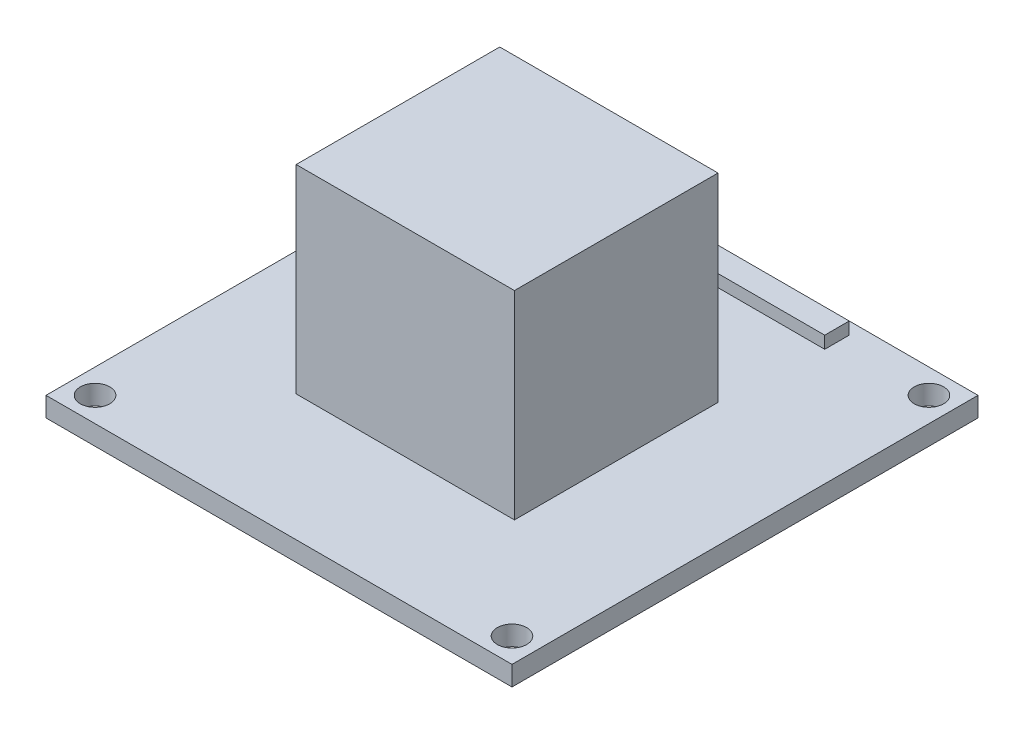
ISO-10303-21;
HEADER;
FILE_DESCRIPTION(('STEP AP214'),'2;1');
FILE_NAME('part.step','',(''),(''),'','','');
FILE_SCHEMA(('AUTOMOTIVE_DESIGN { 1 0 10303 214 1 1 1 1 }'));
ENDSEC;
DATA;
#1=APPLICATION_CONTEXT('core data for automotive mechanical design processes');
#2=APPLICATION_PROTOCOL_DEFINITION('international standard','automotive_design',2000,#1);
#3=PRODUCT_CONTEXT('',#1,'mechanical');
#4=PRODUCT('Part','Part','',(#3));
#5=PRODUCT_RELATED_PRODUCT_CATEGORY('part','',(#4));
#6=PRODUCT_DEFINITION_FORMATION('','',#4);
#7=PRODUCT_DEFINITION_CONTEXT('part definition',#1,'design');
#8=PRODUCT_DEFINITION('design','',#6,#7);
#9=PRODUCT_DEFINITION_SHAPE('','',#8);
#10=(LENGTH_UNIT() NAMED_UNIT(*) SI_UNIT(.MILLI.,.METRE.));
#11=(NAMED_UNIT(*) PLANE_ANGLE_UNIT() SI_UNIT($,.RADIAN.));
#12=(NAMED_UNIT(*) SI_UNIT($,.STERADIAN.) SOLID_ANGLE_UNIT());
#13=UNCERTAINTY_MEASURE_WITH_UNIT(LENGTH_MEASURE(1.E-05),#10,'distance_accuracy_value','');
#14=(GEOMETRIC_REPRESENTATION_CONTEXT(3) GLOBAL_UNCERTAINTY_ASSIGNED_CONTEXT((#13)) GLOBAL_UNIT_ASSIGNED_CONTEXT((#10,
#11,#12)) REPRESENTATION_CONTEXT('',''));
#15=CARTESIAN_POINT('',(0.,0.,0.));
#16=DIRECTION('',(0.,0.,1.));
#17=DIRECTION('',(1.,0.,0.));
#18=AXIS2_PLACEMENT_3D('',#15,#16,#17);
#19=CARTESIAN_POINT('',(0.,1.6,0.));
#20=DIRECTION('',(0.,1.,0.));
#21=DIRECTION('',(0.,0.,1.));
#22=AXIS2_PLACEMENT_3D('',#19,#20,#21);
#23=PLANE('',#22);
#24=DIRECTION('',(0.,0.,1.));
#25=VECTOR('',#24,1.);
#26=CARTESIAN_POINT('',(-8.9,1.6,-7.9));
#27=LINE('',#26,#25);
#28=CARTESIAN_POINT('',(-8.9,1.6,-7.9));
#29=VERTEX_POINT('',#28);
#30=CARTESIAN_POINT('',(-8.9,1.6,8.7));
#31=VERTEX_POINT('',#30);
#32=EDGE_CURVE('E66',#29,#31,#27,.T.);
#33=ORIENTED_EDGE('',*,*,#32,.F.);
#34=DIRECTION('',(-1.,0.,0.));
#35=VECTOR('',#34,1.);
#36=CARTESIAN_POINT('',(-8.9,1.6,-7.9));
#37=LINE('',#36,#35);
#38=CARTESIAN_POINT('',(8.9,1.6,-7.9));
#39=VERTEX_POINT('',#38);
#40=EDGE_CURVE('E167',#39,#29,#37,.T.);
#41=ORIENTED_EDGE('',*,*,#40,.F.);
#42=DIRECTION('',(0.,0.,-1.));
#43=VECTOR('',#42,1.);
#44=CARTESIAN_POINT('',(8.9,1.6,-7.9));
#45=LINE('',#44,#43);
#46=CARTESIAN_POINT('',(8.9,1.6,8.7));
#47=VERTEX_POINT('',#46);
#48=EDGE_CURVE('E176',#47,#39,#45,.T.);
#49=ORIENTED_EDGE('',*,*,#48,.F.);
#50=DIRECTION('',(1.,0.,0.));
#51=VECTOR('',#50,1.);
#52=CARTESIAN_POINT('',(-8.9,1.6,8.7));
#53=LINE('',#52,#51);
#54=EDGE_CURVE('E158',#31,#47,#53,.T.);
#55=ORIENTED_EDGE('',*,*,#54,.F.);
#56=EDGE_LOOP('',(#33,#41,#49,#55));
#57=FACE_BOUND('',#56,.T.);
#58=CARTESIAN_POINT('',(17.0000000000004,1.6,17.));
#59=DIRECTION('',(0.,1.,0.));
#60=DIRECTION('',(0.,0.,1.));
#61=AXIS2_PLACEMENT_3D('',#58,#59,#60);
#62=CIRCLE('',#61,1.2);
#63=CARTESIAN_POINT('',(17.0000000000004,1.6,18.2));
#64=VERTEX_POINT('',#63);
#65=EDGE_CURVE('E198',#64,#64,#62,.T.);
#66=ORIENTED_EDGE('',*,*,#65,.F.);
#67=EDGE_LOOP('',(#66));
#68=FACE_BOUND('',#67,.T.);
#69=CARTESIAN_POINT('',(-17.,1.6,-17.));
#70=DIRECTION('',(0.,1.,0.));
#71=DIRECTION('',(0.,0.,1.));
#72=AXIS2_PLACEMENT_3D('',#69,#70,#71);
#73=CIRCLE('',#72,1.2);
#74=CARTESIAN_POINT('',(-17.,1.6,-15.8));
#75=VERTEX_POINT('',#74);
#76=EDGE_CURVE('E210',#75,#75,#73,.T.);
#77=ORIENTED_EDGE('',*,*,#76,.F.);
#78=EDGE_LOOP('',(#77));
#79=FACE_BOUND('',#78,.T.);
#80=DIRECTION('',(0.,0.,1.));
#81=VECTOR('',#80,1.);
#82=CARTESIAN_POINT('',(-19.,1.6,-19.));
#83=LINE('',#82,#81);
#84=CARTESIAN_POINT('',(-19.,1.6,-19.));
#85=VERTEX_POINT('',#84);
#86=CARTESIAN_POINT('',(-19.,1.6,19.));
#87=VERTEX_POINT('',#86);
#88=EDGE_CURVE('E216',#85,#87,#83,.T.);
#89=ORIENTED_EDGE('',*,*,#88,.T.);
#90=DIRECTION('',(1.,0.,0.));
#91=VECTOR('',#90,1.);
#92=CARTESIAN_POINT('',(-19.,1.6,19.));
#93=LINE('',#92,#91);
#94=CARTESIAN_POINT('',(19.,1.6,19.));
#95=VERTEX_POINT('',#94);
#96=EDGE_CURVE('E219',#87,#95,#93,.T.);
#97=ORIENTED_EDGE('',*,*,#96,.T.);
#98=DIRECTION('',(0.,0.,-1.));
#99=VECTOR('',#98,1.);
#100=CARTESIAN_POINT('',(19.,1.6,-19.));
#101=LINE('',#100,#99);
#102=CARTESIAN_POINT('',(19.,1.6,-19.));
#103=VERTEX_POINT('',#102);
#104=EDGE_CURVE('E222',#95,#103,#101,.T.);
#105=ORIENTED_EDGE('',*,*,#104,.T.);
#106=DIRECTION('',(-1.,0.,0.));
#107=VECTOR('',#106,1.);
#108=CARTESIAN_POINT('',(-19.,1.6,-19.));
#109=LINE('',#108,#107);
#110=EDGE_CURVE('E224',#103,#85,#109,.T.);
#111=ORIENTED_EDGE('',*,*,#110,.T.);
#112=EDGE_LOOP('',(#89,#97,#105,#111));
#113=FACE_BOUND('',#112,.T.);
#114=CARTESIAN_POINT('',(17.,1.6,-17.));
#115=DIRECTION('',(0.,1.,0.));
#116=DIRECTION('',(0.,0.,1.));
#117=AXIS2_PLACEMENT_3D('',#114,#115,#116);
#118=CIRCLE('',#117,1.2);
#119=CARTESIAN_POINT('',(17.,1.6,-15.8));
#120=VERTEX_POINT('',#119);
#121=EDGE_CURVE('E204',#120,#120,#118,.T.);
#122=ORIENTED_EDGE('',*,*,#121,.F.);
#123=EDGE_LOOP('',(#122));
#124=FACE_BOUND('',#123,.T.);
#125=CARTESIAN_POINT('',(-16.9999999999996,1.6,17.));
#126=DIRECTION('',(0.,1.,0.));
#127=DIRECTION('',(0.,0.,1.));
#128=AXIS2_PLACEMENT_3D('',#125,#126,#127);
#129=CIRCLE('',#128,1.2);
#130=CARTESIAN_POINT('',(-16.9999999999996,1.6,18.2));
#131=VERTEX_POINT('',#130);
#132=EDGE_CURVE('E192',#131,#131,#129,.T.);
#133=ORIENTED_EDGE('',*,*,#132,.F.);
#134=EDGE_LOOP('',(#133));
#135=FACE_BOUND('',#134,.T.);
#136=DIRECTION('',(1.,0.,0.));
#137=VECTOR('',#136,1.);
#138=CARTESIAN_POINT('',(-9.5,1.6,-16.));
#139=LINE('',#138,#137);
#140=CARTESIAN_POINT('',(-9.5,1.6,-16.));
#141=VERTEX_POINT('',#140);
#142=CARTESIAN_POINT('',(9.5,1.6,-16.));
#143=VERTEX_POINT('',#142);
#144=EDGE_CURVE('E518',#141,#143,#139,.T.);
#145=ORIENTED_EDGE('',*,*,#144,.F.);
#146=DIRECTION('',(0.,0.,1.));
#147=VECTOR('',#146,1.);
#148=CARTESIAN_POINT('',(-9.5,1.6,-18.));
#149=LINE('',#148,#147);
#150=CARTESIAN_POINT('',(-9.5,1.6,-18.));
#151=VERTEX_POINT('',#150);
#152=EDGE_CURVE('E155',#151,#141,#149,.T.);
#153=ORIENTED_EDGE('',*,*,#152,.F.);
#154=DIRECTION('',(-1.,0.,0.));
#155=VECTOR('',#154,1.);
#156=CARTESIAN_POINT('',(-9.5,1.6,-18.));
#157=LINE('',#156,#155);
#158=CARTESIAN_POINT('',(9.5,1.6,-18.));
#159=VERTEX_POINT('',#158);
#160=EDGE_CURVE('E151',#159,#151,#157,.T.);
#161=ORIENTED_EDGE('',*,*,#160,.F.);
#162=DIRECTION('',(0.,0.,-1.));
#163=VECTOR('',#162,1.);
#164=CARTESIAN_POINT('',(9.5,1.6,-18.));
#165=LINE('',#164,#163);
#166=EDGE_CURVE('E515',#143,#159,#165,.T.);
#167=ORIENTED_EDGE('',*,*,#166,.F.);
#168=EDGE_LOOP('',(#145,#153,#161,#167));
#169=FACE_BOUND('',#168,.T.);
#170=ADVANCED_FACE('F43',(#57,#68,#79,#113,#124,#135,#169),#23,.T.);
#171=CARTESIAN_POINT('',(0.,0.,0.));
#172=DIRECTION('',(0.,1.,0.));
#173=DIRECTION('',(0.,0.,1.));
#174=AXIS2_PLACEMENT_3D('',#171,#172,#173);
#175=PLANE('',#174);
#176=DIRECTION('',(0.,0.,1.));
#177=VECTOR('',#176,1.);
#178=CARTESIAN_POINT('',(-19.,0.,-19.));
#179=LINE('',#178,#177);
#180=CARTESIAN_POINT('',(-19.,0.,-19.));
#181=VERTEX_POINT('',#180);
#182=CARTESIAN_POINT('',(-19.,0.,19.));
#183=VERTEX_POINT('',#182);
#184=EDGE_CURVE('E213',#181,#183,#179,.T.);
#185=ORIENTED_EDGE('',*,*,#184,.F.);
#186=DIRECTION('',(-1.,0.,0.));
#187=VECTOR('',#186,1.);
#188=CARTESIAN_POINT('',(-19.,0.,-19.));
#189=LINE('',#188,#187);
#190=CARTESIAN_POINT('',(19.,0.,-19.));
#191=VERTEX_POINT('',#190);
#192=EDGE_CURVE('E220',#191,#181,#189,.T.);
#193=ORIENTED_EDGE('',*,*,#192,.F.);
#194=DIRECTION('',(0.,0.,-1.));
#195=VECTOR('',#194,1.);
#196=CARTESIAN_POINT('',(19.,0.,-19.));
#197=LINE('',#196,#195);
#198=CARTESIAN_POINT('',(19.,0.,19.));
#199=VERTEX_POINT('',#198);
#200=EDGE_CURVE('E231',#199,#191,#197,.T.);
#201=ORIENTED_EDGE('',*,*,#200,.F.);
#202=DIRECTION('',(1.,0.,0.));
#203=VECTOR('',#202,1.);
#204=CARTESIAN_POINT('',(-19.,0.,19.));
#205=LINE('',#204,#203);
#206=EDGE_CURVE('E229',#183,#199,#205,.T.);
#207=ORIENTED_EDGE('',*,*,#206,.F.);
#208=EDGE_LOOP('',(#185,#193,#201,#207));
#209=FACE_BOUND('',#208,.T.);
#210=CARTESIAN_POINT('',(-17.,0.,-17.));
#211=DIRECTION('',(0.,1.,0.));
#212=DIRECTION('',(0.,0.,1.));
#213=AXIS2_PLACEMENT_3D('',#210,#211,#212);
#214=CIRCLE('',#213,1.2);
#215=CARTESIAN_POINT('',(-17.,0.,-15.8));
#216=VERTEX_POINT('',#215);
#217=EDGE_CURVE('E207',#216,#216,#214,.T.);
#218=ORIENTED_EDGE('',*,*,#217,.T.);
#219=EDGE_LOOP('',(#218));
#220=FACE_BOUND('',#219,.T.);
#221=CARTESIAN_POINT('',(17.,0.,-17.));
#222=DIRECTION('',(0.,1.,0.));
#223=DIRECTION('',(0.,0.,1.));
#224=AXIS2_PLACEMENT_3D('',#221,#222,#223);
#225=CIRCLE('',#224,1.2);
#226=CARTESIAN_POINT('',(17.,0.,-15.8));
#227=VERTEX_POINT('',#226);
#228=EDGE_CURVE('E201',#227,#227,#225,.T.);
#229=ORIENTED_EDGE('',*,*,#228,.T.);
#230=EDGE_LOOP('',(#229));
#231=FACE_BOUND('',#230,.T.);
#232=CARTESIAN_POINT('',(17.0000000000004,0.,17.));
#233=DIRECTION('',(0.,1.,0.));
#234=DIRECTION('',(0.,0.,1.));
#235=AXIS2_PLACEMENT_3D('',#232,#233,#234);
#236=CIRCLE('',#235,1.2);
#237=CARTESIAN_POINT('',(17.0000000000004,0.,18.2));
#238=VERTEX_POINT('',#237);
#239=EDGE_CURVE('E195',#238,#238,#236,.T.);
#240=ORIENTED_EDGE('',*,*,#239,.T.);
#241=EDGE_LOOP('',(#240));
#242=FACE_BOUND('',#241,.T.);
#243=CARTESIAN_POINT('',(-16.9999999999996,0.,17.));
#244=DIRECTION('',(0.,1.,0.));
#245=DIRECTION('',(0.,0.,1.));
#246=AXIS2_PLACEMENT_3D('',#243,#244,#245);
#247=CIRCLE('',#246,1.2);
#248=CARTESIAN_POINT('',(-16.9999999999996,0.,18.2));
#249=VERTEX_POINT('',#248);
#250=EDGE_CURVE('E191',#249,#249,#247,.T.);
#251=ORIENTED_EDGE('',*,*,#250,.T.);
#252=EDGE_LOOP('',(#251));
#253=FACE_BOUND('',#252,.T.);
#254=ADVANCED_FACE('F249',(#209,#220,#231,#242,#253),#175,.F.);
#255=CARTESIAN_POINT('',(-19.,1.6,-19.));
#256=DIRECTION('',(1.,0.,0.));
#257=DIRECTION('',(0.,0.,-1.));
#258=AXIS2_PLACEMENT_3D('',#255,#256,#257);
#259=PLANE('',#258);
#260=ORIENTED_EDGE('',*,*,#184,.T.);
#261=DIRECTION('',(0.,-1.,0.));
#262=VECTOR('',#261,1.);
#263=CARTESIAN_POINT('',(-19.,1.6,19.));
#264=LINE('',#263,#262);
#265=EDGE_CURVE('E11',#87,#183,#264,.T.);
#266=ORIENTED_EDGE('',*,*,#265,.F.);
#267=ORIENTED_EDGE('',*,*,#88,.F.);
#268=DIRECTION('',(0.,-1.,0.));
#269=VECTOR('',#268,1.);
#270=CARTESIAN_POINT('',(-19.,1.6,-19.));
#271=LINE('',#270,#269);
#272=EDGE_CURVE('E226',#85,#181,#271,.T.);
#273=ORIENTED_EDGE('',*,*,#272,.T.);
#274=EDGE_LOOP('',(#260,#266,#267,#273));
#275=FACE_BOUND('',#274,.T.);
#276=ADVANCED_FACE('F45',(#275),#259,.F.);
#277=CARTESIAN_POINT('',(-19.,1.6,19.));
#278=DIRECTION('',(0.,0.,-1.));
#279=DIRECTION('',(-1.,0.,0.));
#280=AXIS2_PLACEMENT_3D('',#277,#278,#279);
#281=PLANE('',#280);
#282=ORIENTED_EDGE('',*,*,#206,.T.);
#283=DIRECTION('',(0.,-1.,0.));
#284=VECTOR('',#283,1.);
#285=CARTESIAN_POINT('',(19.,1.6,19.));
#286=LINE('',#285,#284);
#287=EDGE_CURVE('E51',#95,#199,#286,.T.);
#288=ORIENTED_EDGE('',*,*,#287,.F.);
#289=ORIENTED_EDGE('',*,*,#96,.F.);
#290=ORIENTED_EDGE('',*,*,#265,.T.);
#291=EDGE_LOOP('',(#282,#288,#289,#290));
#292=FACE_BOUND('',#291,.T.);
#293=ADVANCED_FACE('F260',(#292),#281,.F.);
#294=CARTESIAN_POINT('',(19.,1.6,-19.));
#295=DIRECTION('',(-1.,0.,0.));
#296=DIRECTION('',(0.,0.,1.));
#297=AXIS2_PLACEMENT_3D('',#294,#295,#296);
#298=PLANE('',#297);
#299=ORIENTED_EDGE('',*,*,#200,.T.);
#300=DIRECTION('',(0.,-1.,0.));
#301=VECTOR('',#300,1.);
#302=CARTESIAN_POINT('',(19.,1.6,-19.));
#303=LINE('',#302,#301);
#304=EDGE_CURVE('E236',#103,#191,#303,.T.);
#305=ORIENTED_EDGE('',*,*,#304,.F.);
#306=ORIENTED_EDGE('',*,*,#104,.F.);
#307=ORIENTED_EDGE('',*,*,#287,.T.);
#308=EDGE_LOOP('',(#299,#305,#306,#307));
#309=FACE_BOUND('',#308,.T.);
#310=ADVANCED_FACE('F243',(#309),#298,.F.);
#311=CARTESIAN_POINT('',(-19.,1.6,-19.));
#312=DIRECTION('',(0.,0.,1.));
#313=DIRECTION('',(1.,0.,0.));
#314=AXIS2_PLACEMENT_3D('',#311,#312,#313);
#315=PLANE('',#314);
#316=ORIENTED_EDGE('',*,*,#192,.T.);
#317=ORIENTED_EDGE('',*,*,#272,.F.);
#318=ORIENTED_EDGE('',*,*,#110,.F.);
#319=ORIENTED_EDGE('',*,*,#304,.T.);
#320=EDGE_LOOP('',(#316,#317,#318,#319));
#321=FACE_BOUND('',#320,.T.);
#322=ADVANCED_FACE('F253',(#321),#315,.F.);
#323=CARTESIAN_POINT('',(-17.,1.6,-17.));
#324=DIRECTION('',(0.,-1.,0.));
#325=DIRECTION('',(0.,0.,-1.));
#326=AXIS2_PLACEMENT_3D('',#323,#324,#325);
#327=CYLINDRICAL_SURFACE('',#326,1.2);
#328=ORIENTED_EDGE('',*,*,#76,.T.);
#329=EDGE_LOOP('',(#328));
#330=FACE_BOUND('',#329,.T.);
#331=ORIENTED_EDGE('',*,*,#217,.F.);
#332=EDGE_LOOP('',(#331));
#333=FACE_BOUND('',#332,.T.);
#334=ADVANCED_FACE('F275',(#330,#333),#327,.F.);
#335=CARTESIAN_POINT('',(17.,1.6,-17.));
#336=DIRECTION('',(0.,-1.,0.));
#337=DIRECTION('',(0.,0.,-1.));
#338=AXIS2_PLACEMENT_3D('',#335,#336,#337);
#339=CYLINDRICAL_SURFACE('',#338,1.2);
#340=ORIENTED_EDGE('',*,*,#121,.T.);
#341=EDGE_LOOP('',(#340));
#342=FACE_BOUND('',#341,.T.);
#343=ORIENTED_EDGE('',*,*,#228,.F.);
#344=EDGE_LOOP('',(#343));
#345=FACE_BOUND('',#344,.T.);
#346=ADVANCED_FACE('F282',(#342,#345),#339,.F.);
#347=CARTESIAN_POINT('',(17.0000000000004,1.6,17.));
#348=DIRECTION('',(0.,-1.,0.));
#349=DIRECTION('',(0.,0.,-1.));
#350=AXIS2_PLACEMENT_3D('',#347,#348,#349);
#351=CYLINDRICAL_SURFACE('',#350,1.2);
#352=ORIENTED_EDGE('',*,*,#65,.T.);
#353=EDGE_LOOP('',(#352));
#354=FACE_BOUND('',#353,.T.);
#355=ORIENTED_EDGE('',*,*,#239,.F.);
#356=EDGE_LOOP('',(#355));
#357=FACE_BOUND('',#356,.T.);
#358=ADVANCED_FACE('F287',(#354,#357),#351,.F.);
#359=CARTESIAN_POINT('',(-16.9999999999996,1.6,17.));
#360=DIRECTION('',(0.,-1.,0.));
#361=DIRECTION('',(0.,0.,-1.));
#362=AXIS2_PLACEMENT_3D('',#359,#360,#361);
#363=CYLINDRICAL_SURFACE('',#362,1.2);
#364=ORIENTED_EDGE('',*,*,#132,.T.);
#365=EDGE_LOOP('',(#364));
#366=FACE_BOUND('',#365,.T.);
#367=ORIENTED_EDGE('',*,*,#250,.F.);
#368=EDGE_LOOP('',(#367));
#369=FACE_BOUND('',#368,.T.);
#370=ADVANCED_FACE('F299',(#366,#369),#363,.F.);
#371=CARTESIAN_POINT('',(-8.9,17.8,-7.9));
#372=DIRECTION('',(1.,0.,0.));
#373=DIRECTION('',(0.,0.,-1.));
#374=AXIS2_PLACEMENT_3D('',#371,#372,#373);
#375=PLANE('',#374);
#376=ORIENTED_EDGE('',*,*,#32,.T.);
#377=DIRECTION('',(0.,-1.,0.));
#378=VECTOR('',#377,1.);
#379=CARTESIAN_POINT('',(-8.9,17.8,8.7));
#380=LINE('',#379,#378);
#381=CARTESIAN_POINT('',(-8.9,17.8,8.7));
#382=VERTEX_POINT('',#381);
#383=EDGE_CURVE('E188',#382,#31,#380,.T.);
#384=ORIENTED_EDGE('',*,*,#383,.F.);
#385=DIRECTION('',(0.,0.,1.));
#386=VECTOR('',#385,1.);
#387=CARTESIAN_POINT('',(-8.9,17.8,-7.9));
#388=LINE('',#387,#386);
#389=CARTESIAN_POINT('',(-8.9,17.8,-7.9));
#390=VERTEX_POINT('',#389);
#391=EDGE_CURVE('E163',#390,#382,#388,.T.);
#392=ORIENTED_EDGE('',*,*,#391,.F.);
#393=DIRECTION('',(0.,-1.,0.));
#394=VECTOR('',#393,1.);
#395=CARTESIAN_POINT('',(-8.9,17.8,-7.9));
#396=LINE('',#395,#394);
#397=EDGE_CURVE('E172',#390,#29,#396,.T.);
#398=ORIENTED_EDGE('',*,*,#397,.T.);
#399=EDGE_LOOP('',(#376,#384,#392,#398));
#400=FACE_BOUND('',#399,.T.);
#401=ADVANCED_FACE('F301',(#400),#375,.F.);
#402=CARTESIAN_POINT('',(-8.9,17.8,8.7));
#403=DIRECTION('',(0.,0.,-1.));
#404=DIRECTION('',(-1.,0.,0.));
#405=AXIS2_PLACEMENT_3D('',#402,#403,#404);
#406=PLANE('',#405);
#407=ORIENTED_EDGE('',*,*,#54,.T.);
#408=DIRECTION('',(0.,-1.,0.));
#409=VECTOR('',#408,1.);
#410=CARTESIAN_POINT('',(8.9,17.8,8.7));
#411=LINE('',#410,#409);
#412=CARTESIAN_POINT('',(8.9,17.8,8.7));
#413=VERTEX_POINT('',#412);
#414=EDGE_CURVE('E185',#413,#47,#411,.T.);
#415=ORIENTED_EDGE('',*,*,#414,.F.);
#416=DIRECTION('',(1.,0.,0.));
#417=VECTOR('',#416,1.);
#418=CARTESIAN_POINT('',(-8.9,17.8,8.7));
#419=LINE('',#418,#417);
#420=EDGE_CURVE('E166',#382,#413,#419,.T.);
#421=ORIENTED_EDGE('',*,*,#420,.F.);
#422=ORIENTED_EDGE('',*,*,#383,.T.);
#423=EDGE_LOOP('',(#407,#415,#421,#422));
#424=FACE_BOUND('',#423,.T.);
#425=ADVANCED_FACE('F308',(#424),#406,.F.);
#426=CARTESIAN_POINT('',(8.9,17.8,-7.9));
#427=DIRECTION('',(-1.,0.,0.));
#428=DIRECTION('',(0.,0.,1.));
#429=AXIS2_PLACEMENT_3D('',#426,#427,#428);
#430=PLANE('',#429);
#431=ORIENTED_EDGE('',*,*,#48,.T.);
#432=DIRECTION('',(0.,-1.,0.));
#433=VECTOR('',#432,1.);
#434=CARTESIAN_POINT('',(8.9,17.8,-7.9));
#435=LINE('',#434,#433);
#436=CARTESIAN_POINT('',(8.9,17.8,-7.9));
#437=VERTEX_POINT('',#436);
#438=EDGE_CURVE('E182',#437,#39,#435,.T.);
#439=ORIENTED_EDGE('',*,*,#438,.F.);
#440=DIRECTION('',(0.,0.,-1.));
#441=VECTOR('',#440,1.);
#442=CARTESIAN_POINT('',(8.9,17.8,-7.9));
#443=LINE('',#442,#441);
#444=EDGE_CURVE('E169',#413,#437,#443,.T.);
#445=ORIENTED_EDGE('',*,*,#444,.F.);
#446=ORIENTED_EDGE('',*,*,#414,.T.);
#447=EDGE_LOOP('',(#431,#439,#445,#446));
#448=FACE_BOUND('',#447,.T.);
#449=ADVANCED_FACE('F316',(#448),#430,.F.);
#450=CARTESIAN_POINT('',(-8.9,17.8,-7.9));
#451=DIRECTION('',(0.,0.,1.));
#452=DIRECTION('',(1.,0.,0.));
#453=AXIS2_PLACEMENT_3D('',#450,#451,#452);
#454=PLANE('',#453);
#455=ORIENTED_EDGE('',*,*,#40,.T.);
#456=ORIENTED_EDGE('',*,*,#397,.F.);
#457=DIRECTION('',(-1.,0.,0.));
#458=VECTOR('',#457,1.);
#459=CARTESIAN_POINT('',(-8.9,17.8,-7.9));
#460=LINE('',#459,#458);
#461=EDGE_CURVE('E171',#437,#390,#460,.T.);
#462=ORIENTED_EDGE('',*,*,#461,.F.);
#463=ORIENTED_EDGE('',*,*,#438,.T.);
#464=EDGE_LOOP('',(#455,#456,#462,#463));
#465=FACE_BOUND('',#464,.T.);
#466=ADVANCED_FACE('F320',(#465),#454,.F.);
#467=CARTESIAN_POINT('',(0.,17.8,0.));
#468=DIRECTION('',(0.,1.,0.));
#469=DIRECTION('',(0.,0.,1.));
#470=AXIS2_PLACEMENT_3D('',#467,#468,#469);
#471=PLANE('',#470);
#472=ORIENTED_EDGE('',*,*,#391,.T.);
#473=ORIENTED_EDGE('',*,*,#420,.T.);
#474=ORIENTED_EDGE('',*,*,#444,.T.);
#475=ORIENTED_EDGE('',*,*,#461,.T.);
#476=EDGE_LOOP('',(#472,#473,#474,#475));
#477=FACE_BOUND('',#476,.T.);
#478=ADVANCED_FACE('F324',(#477),#471,.T.);
#479=CARTESIAN_POINT('',(-9.5,2.6,-18.));
#480=DIRECTION('',(1.,0.,0.));
#481=DIRECTION('',(0.,0.,-1.));
#482=AXIS2_PLACEMENT_3D('',#479,#480,#481);
#483=PLANE('',#482);
#484=ORIENTED_EDGE('',*,*,#152,.T.);
#485=DIRECTION('',(0.,-1.,0.));
#486=VECTOR('',#485,1.);
#487=CARTESIAN_POINT('',(-9.5,2.6,-16.));
#488=LINE('',#487,#486);
#489=CARTESIAN_POINT('',(-9.5,2.6,-16.));
#490=VERTEX_POINT('',#489);
#491=EDGE_CURVE('E136',#490,#141,#488,.T.);
#492=ORIENTED_EDGE('',*,*,#491,.F.);
#493=DIRECTION('',(0.,0.,1.));
#494=VECTOR('',#493,1.);
#495=CARTESIAN_POINT('',(-9.5,2.6,-18.));
#496=LINE('',#495,#494);
#497=CARTESIAN_POINT('',(-9.5,2.6,-18.));
#498=VERTEX_POINT('',#497);
#499=EDGE_CURVE('E143',#498,#490,#496,.T.);
#500=ORIENTED_EDGE('',*,*,#499,.F.);
#501=DIRECTION('',(0.,-1.,0.));
#502=VECTOR('',#501,1.);
#503=CARTESIAN_POINT('',(-9.5,2.6,-18.));
#504=LINE('',#503,#502);
#505=EDGE_CURVE('E512',#498,#151,#504,.T.);
#506=ORIENTED_EDGE('',*,*,#505,.T.);
#507=EDGE_LOOP('',(#484,#492,#500,#506));
#508=FACE_BOUND('',#507,.T.);
#509=ADVANCED_FACE('F153',(#508),#483,.F.);
#510=CARTESIAN_POINT('',(-9.5,2.6,-16.));
#511=DIRECTION('',(0.,0.,-1.));
#512=DIRECTION('',(-1.,0.,0.));
#513=AXIS2_PLACEMENT_3D('',#510,#511,#512);
#514=PLANE('',#513);
#515=ORIENTED_EDGE('',*,*,#144,.T.);
#516=DIRECTION('',(0.,-1.,0.));
#517=VECTOR('',#516,1.);
#518=CARTESIAN_POINT('',(9.5,2.6,-16.));
#519=LINE('',#518,#517);
#520=CARTESIAN_POINT('',(9.5,2.6,-16.));
#521=VERTEX_POINT('',#520);
#522=EDGE_CURVE('E139',#521,#143,#519,.T.);
#523=ORIENTED_EDGE('',*,*,#522,.F.);
#524=DIRECTION('',(1.,0.,0.));
#525=VECTOR('',#524,1.);
#526=CARTESIAN_POINT('',(-9.5,2.6,-16.));
#527=LINE('',#526,#525);
#528=EDGE_CURVE('E132',#490,#521,#527,.T.);
#529=ORIENTED_EDGE('',*,*,#528,.F.);
#530=ORIENTED_EDGE('',*,*,#491,.T.);
#531=EDGE_LOOP('',(#515,#523,#529,#530));
#532=FACE_BOUND('',#531,.T.);
#533=ADVANCED_FACE('F134',(#532),#514,.F.);
#534=CARTESIAN_POINT('',(9.5,2.6,-18.));
#535=DIRECTION('',(-1.,0.,0.));
#536=DIRECTION('',(0.,0.,1.));
#537=AXIS2_PLACEMENT_3D('',#534,#535,#536);
#538=PLANE('',#537);
#539=ORIENTED_EDGE('',*,*,#166,.T.);
#540=DIRECTION('',(0.,-1.,0.));
#541=VECTOR('',#540,1.);
#542=CARTESIAN_POINT('',(9.5,2.6,-18.));
#543=LINE('',#542,#541);
#544=CARTESIAN_POINT('',(9.5,2.6,-18.));
#545=VERTEX_POINT('',#544);
#546=EDGE_CURVE('E58',#545,#159,#543,.T.);
#547=ORIENTED_EDGE('',*,*,#546,.F.);
#548=DIRECTION('',(0.,0.,-1.));
#549=VECTOR('',#548,1.);
#550=CARTESIAN_POINT('',(9.5,2.6,-18.));
#551=LINE('',#550,#549);
#552=EDGE_CURVE('E142',#521,#545,#551,.T.);
#553=ORIENTED_EDGE('',*,*,#552,.F.);
#554=ORIENTED_EDGE('',*,*,#522,.T.);
#555=EDGE_LOOP('',(#539,#547,#553,#554));
#556=FACE_BOUND('',#555,.T.);
#557=ADVANCED_FACE('F333',(#556),#538,.F.);
#558=CARTESIAN_POINT('',(-9.5,2.6,-18.));
#559=DIRECTION('',(0.,0.,1.));
#560=DIRECTION('',(1.,0.,0.));
#561=AXIS2_PLACEMENT_3D('',#558,#559,#560);
#562=PLANE('',#561);
#563=ORIENTED_EDGE('',*,*,#160,.T.);
#564=ORIENTED_EDGE('',*,*,#505,.F.);
#565=DIRECTION('',(-1.,0.,0.));
#566=VECTOR('',#565,1.);
#567=CARTESIAN_POINT('',(-9.5,2.6,-18.));
#568=LINE('',#567,#566);
#569=EDGE_CURVE('E147',#545,#498,#568,.T.);
#570=ORIENTED_EDGE('',*,*,#569,.F.);
#571=ORIENTED_EDGE('',*,*,#546,.T.);
#572=EDGE_LOOP('',(#563,#564,#570,#571));
#573=FACE_BOUND('',#572,.T.);
#574=ADVANCED_FACE('F336',(#573),#562,.F.);
#575=CARTESIAN_POINT('',(0.,2.6,0.));
#576=DIRECTION('',(0.,1.,0.));
#577=DIRECTION('',(0.,0.,1.));
#578=AXIS2_PLACEMENT_3D('',#575,#576,#577);
#579=PLANE('',#578);
#580=ORIENTED_EDGE('',*,*,#499,.T.);
#581=ORIENTED_EDGE('',*,*,#528,.T.);
#582=ORIENTED_EDGE('',*,*,#552,.T.);
#583=ORIENTED_EDGE('',*,*,#569,.T.);
#584=EDGE_LOOP('',(#580,#581,#582,#583));
#585=FACE_BOUND('',#584,.T.);
#586=ADVANCED_FACE('F146',(#585),#579,.T.);
#587=CLOSED_SHELL('',(#170,#254,#276,#293,#310,#322,#334,#346,#358,#370,#401,#425,#449,#466,
#478,#509,#533,#557,#574,#586));
#588=MANIFOLD_SOLID_BREP('B2',#587);
#589=ADVANCED_BREP_SHAPE_REPRESENTATION('',(#18,#588),#14);
#590=SHAPE_DEFINITION_REPRESENTATION(#9,#589);
ENDSEC;
END-ISO-10303-21;
